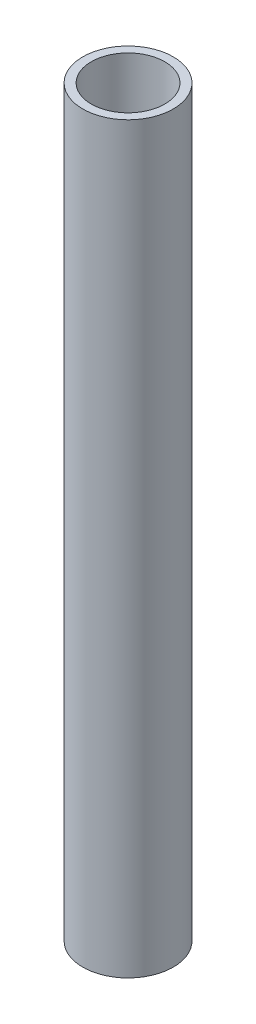
ISO-10303-21;
HEADER;
FILE_DESCRIPTION(('STEP AP214'),'2;1');
FILE_NAME('part.step','',(''),(''),'','','');
FILE_SCHEMA(('AUTOMOTIVE_DESIGN { 1 0 10303 214 1 1 1 1 }'));
ENDSEC;
DATA;
#1=APPLICATION_CONTEXT('core data for automotive mechanical design processes');
#2=APPLICATION_PROTOCOL_DEFINITION('international standard','automotive_design',2000,#1);
#3=PRODUCT_CONTEXT('',#1,'mechanical');
#4=PRODUCT('Part','Part','',(#3));
#5=PRODUCT_RELATED_PRODUCT_CATEGORY('part','',(#4));
#6=PRODUCT_DEFINITION_FORMATION('','',#4);
#7=PRODUCT_DEFINITION_CONTEXT('part definition',#1,'design');
#8=PRODUCT_DEFINITION('design','',#6,#7);
#9=PRODUCT_DEFINITION_SHAPE('','',#8);
#10=(LENGTH_UNIT() NAMED_UNIT(*) SI_UNIT(.MILLI.,.METRE.));
#11=(NAMED_UNIT(*) PLANE_ANGLE_UNIT() SI_UNIT($,.RADIAN.));
#12=(NAMED_UNIT(*) SI_UNIT($,.STERADIAN.) SOLID_ANGLE_UNIT());
#13=UNCERTAINTY_MEASURE_WITH_UNIT(LENGTH_MEASURE(1.E-05),#10,'distance_accuracy_value','');
#14=(GEOMETRIC_REPRESENTATION_CONTEXT(3) GLOBAL_UNCERTAINTY_ASSIGNED_CONTEXT((#13)) GLOBAL_UNIT_ASSIGNED_CONTEXT((#10,
#11,#12)) REPRESENTATION_CONTEXT('',''));
#15=CARTESIAN_POINT('',(0.,0.,0.));
#16=DIRECTION('',(0.,0.,1.));
#17=DIRECTION('',(1.,0.,0.));
#18=AXIS2_PLACEMENT_3D('',#15,#16,#17);
#19=CARTESIAN_POINT('',(2.48689957516035E-11,174.999999999999,1.50000000000061));
#20=DIRECTION('',(0.,0.999999999999999,0.));
#21=DIRECTION('',(0.,0.,1.));
#22=AXIS2_PLACEMENT_3D('',#19,#20,#21);
#23=PLANE('',#22);
#24=CARTESIAN_POINT('',(2.48689957516035E-11,174.999999999999,1.50000000000061));
#25=DIRECTION('',(0.,0.999999999999999,0.));
#26=DIRECTION('',(0.,0.,1.));
#27=AXIS2_PLACEMENT_3D('',#24,#25,#26);
#28=CIRCLE('',#27,10.65);
#29=CARTESIAN_POINT('',(2.47948378842671E-11,174.999999999999,-9.14999999999938));
#30=VERTEX_POINT('',#29);
#31=EDGE_CURVE('E12',#30,#30,#28,.T.);
#32=ORIENTED_EDGE('',*,*,#31,.T.);
#33=EDGE_LOOP('',(#32));
#34=FACE_BOUND('',#33,.T.);
#35=CARTESIAN_POINT('',(2.48689957516035E-11,174.999999999999,1.50000000000061));
#36=DIRECTION('',(0.,0.999999999999999,0.));
#37=DIRECTION('',(0.,0.,1.));
#38=AXIS2_PLACEMENT_3D('',#35,#36,#37);
#39=CIRCLE('',#38,8.65);
#40=CARTESIAN_POINT('',(2.48087642443303E-11,174.999999999999,-7.14999999999939));
#41=VERTEX_POINT('',#40);
#42=EDGE_CURVE('E60',#41,#41,#39,.T.);
#43=ORIENTED_EDGE('',*,*,#42,.F.);
#44=EDGE_LOOP('',(#43));
#45=FACE_BOUND('',#44,.T.);
#46=ADVANCED_FACE('F46',(#34,#45),#23,.T.);
#47=CARTESIAN_POINT('',(2.44249065417534E-11,-4.44089209850063E-13,1.50000000000061));
#48=DIRECTION('',(0.,0.999999999999999,0.));
#49=DIRECTION('',(0.,0.,1.));
#50=AXIS2_PLACEMENT_3D('',#47,#48,#49);
#51=PLANE('',#50);
#52=CARTESIAN_POINT('',(2.44249065417534E-11,-4.44089209850063E-13,1.50000000000061));
#53=DIRECTION('',(0.,0.999999999999999,0.));
#54=DIRECTION('',(0.,0.,1.));
#55=AXIS2_PLACEMENT_3D('',#52,#53,#54);
#56=CIRCLE('',#55,10.65);
#57=CARTESIAN_POINT('',(2.46438930430036E-11,-4.71844785465692E-13,-9.14999999999933));
#58=VERTEX_POINT('',#57);
#59=EDGE_CURVE('E50',#58,#58,#56,.T.);
#60=ORIENTED_EDGE('',*,*,#59,.F.);
#61=EDGE_LOOP('',(#60));
#62=FACE_BOUND('',#61,.T.);
#63=CARTESIAN_POINT('',(2.44249065417534E-11,-4.44089209850063E-13,1.50000000000061));
#64=DIRECTION('',(0.,0.999999999999999,0.));
#65=DIRECTION('',(0.,0.,1.));
#66=AXIS2_PLACEMENT_3D('',#63,#64,#65);
#67=CIRCLE('',#66,8.65);
#68=CARTESIAN_POINT('',(2.46578194030668E-11,-4.71844785465692E-13,-7.14999999999934));
#69=VERTEX_POINT('',#68);
#70=EDGE_CURVE('E62',#69,#69,#67,.T.);
#71=ORIENTED_EDGE('',*,*,#70,.T.);
#72=EDGE_LOOP('',(#71));
#73=FACE_BOUND('',#72,.T.);
#74=ADVANCED_FACE('F75',(#62,#73),#51,.F.);
#75=CARTESIAN_POINT('',(2.48689957516035E-11,174.999999999999,1.50000000000061));
#76=DIRECTION('',(0.,-0.999999999999999,0.));
#77=DIRECTION('',(0.,0.,-1.));
#78=AXIS2_PLACEMENT_3D('',#75,#76,#77);
#79=CYLINDRICAL_SURFACE('',#78,10.65);
#80=CARTESIAN_POINT('',(2.47948378842671E-11,174.999999999999,-9.14999999999938));
#81=CARTESIAN_POINT('',(2.47932655421706E-11,173.177083333333,-9.14999999999938));
#82=CARTESIAN_POINT('',(2.47916932000741E-11,171.354166666666,-9.14999999999938));
#83=CARTESIAN_POINT('',(2.47885485158811E-11,167.708333333333,-9.14999999999938));
#84=CARTESIAN_POINT('',(2.47869761737846E-11,165.885416666666,-9.14999999999938));
#85=CARTESIAN_POINT('',(2.47838314895916E-11,162.239583333333,-9.14999999999938));
#86=CARTESIAN_POINT('',(2.47822591474951E-11,160.416666666666,-9.14999999999938));
#87=CARTESIAN_POINT('',(2.47791144633021E-11,156.770833333333,-9.14999999999938));
#88=CARTESIAN_POINT('',(2.47775421212056E-11,154.947916666666,-9.14999999999938));
#89=CARTESIAN_POINT('',(2.47743974370127E-11,151.302083333333,-9.14999999999938));
#90=CARTESIAN_POINT('',(2.47728250949162E-11,149.479166666666,-9.14999999999938));
#91=CARTESIAN_POINT('',(2.47696804107232E-11,145.833333333333,-9.14999999999938));
#92=CARTESIAN_POINT('',(2.47681080686267E-11,144.010416666666,-9.14999999999937));
#93=CARTESIAN_POINT('',(2.47649633844337E-11,140.364583333333,-9.14999999999937));
#94=CARTESIAN_POINT('',(2.47633910423372E-11,138.541666666666,-9.14999999999937));
#95=CARTESIAN_POINT('',(2.47602463581442E-11,134.895833333333,-9.14999999999937));
#96=CARTESIAN_POINT('',(2.47586740160477E-11,133.072916666666,-9.14999999999937));
#97=CARTESIAN_POINT('',(2.47555293318547E-11,129.427083333333,-9.14999999999937));
#98=CARTESIAN_POINT('',(2.47539569897582E-11,127.604166666666,-9.14999999999937));
#99=CARTESIAN_POINT('',(2.47508123055652E-11,123.958333333333,-9.14999999999937));
#100=CARTESIAN_POINT('',(2.47492399634687E-11,122.135416666666,-9.14999999999937));
#101=CARTESIAN_POINT('',(2.47460952792758E-11,118.489583333333,-9.14999999999937));
#102=CARTESIAN_POINT('',(2.47445229371793E-11,116.666666666666,-9.14999999999936));
#103=CARTESIAN_POINT('',(2.47413782529863E-11,113.020833333333,-9.14999999999936));
#104=CARTESIAN_POINT('',(2.47398059108898E-11,111.197916666666,-9.14999999999936));
#105=CARTESIAN_POINT('',(2.47366612266968E-11,107.552083333333,-9.14999999999936));
#106=CARTESIAN_POINT('',(2.47350888846003E-11,105.729166666666,-9.14999999999936));
#107=CARTESIAN_POINT('',(2.47319442004073E-11,102.083333333333,-9.14999999999936));
#108=CARTESIAN_POINT('',(2.47303718583108E-11,100.260416666666,-9.14999999999936));
#109=CARTESIAN_POINT('',(2.47272271741178E-11,96.6145833333328,-9.14999999999936));
#110=CARTESIAN_POINT('',(2.47256548320213E-11,94.7916666666661,-9.14999999999936));
#111=CARTESIAN_POINT('',(2.47225101478283E-11,91.1458333333328,-9.14999999999936));
#112=CARTESIAN_POINT('',(2.47209378057318E-11,89.3229166666661,-9.14999999999936));
#113=CARTESIAN_POINT('',(2.47177931215389E-11,85.6770833333328,-9.14999999999936));
#114=CARTESIAN_POINT('',(2.47162207794424E-11,83.8541666666661,-9.14999999999936));
#115=CARTESIAN_POINT('',(2.47130760952494E-11,80.2083333333328,-9.14999999999936));
#116=CARTESIAN_POINT('',(2.47115037531529E-11,78.3854166666661,-9.14999999999936));
#117=CARTESIAN_POINT('',(2.47083590689599E-11,74.7395833333328,-9.14999999999936));
#118=CARTESIAN_POINT('',(2.47067867268634E-11,72.9166666666661,-9.14999999999935));
#119=CARTESIAN_POINT('',(2.47036420426704E-11,69.2708333333328,-9.14999999999935));
#120=CARTESIAN_POINT('',(2.47020697005739E-11,67.4479166666661,-9.14999999999935));
#121=CARTESIAN_POINT('',(2.46989250163809E-11,63.8020833333328,-9.14999999999935));
#122=CARTESIAN_POINT('',(2.46973526742844E-11,61.9791666666661,-9.14999999999935));
#123=CARTESIAN_POINT('',(2.46942079900914E-11,58.3333333333328,-9.14999999999935));
#124=CARTESIAN_POINT('',(2.46926356479949E-11,56.5104166666661,-9.14999999999935));
#125=CARTESIAN_POINT('',(2.4689490963802E-11,52.8645833333328,-9.14999999999935));
#126=CARTESIAN_POINT('',(2.46879186217055E-11,51.0416666666662,-9.14999999999935));
#127=CARTESIAN_POINT('',(2.46847739375125E-11,47.3958333333328,-9.14999999999935));
#128=CARTESIAN_POINT('',(2.4683201595416E-11,45.5729166666662,-9.14999999999935));
#129=CARTESIAN_POINT('',(2.4680056911223E-11,41.9270833333328,-9.14999999999935));
#130=CARTESIAN_POINT('',(2.46784845691265E-11,40.1041666666662,-9.14999999999934));
#131=CARTESIAN_POINT('',(2.46753398849335E-11,36.4583333333329,-9.14999999999934));
#132=CARTESIAN_POINT('',(2.4673767542837E-11,34.6354166666662,-9.14999999999934));
#133=CARTESIAN_POINT('',(2.4670622858644E-11,30.9895833333329,-9.14999999999934));
#134=CARTESIAN_POINT('',(2.46690505165475E-11,29.1666666666662,-9.14999999999934));
#135=CARTESIAN_POINT('',(2.46659058323545E-11,25.5208333333329,-9.14999999999934));
#136=CARTESIAN_POINT('',(2.4664333490258E-11,23.6979166666662,-9.14999999999934));
#137=CARTESIAN_POINT('',(2.46611888060651E-11,20.0520833333328,-9.14999999999934));
#138=CARTESIAN_POINT('',(2.46596164639686E-11,18.2291666666662,-9.14999999999934));
#139=CARTESIAN_POINT('',(2.46564717797756E-11,14.5833333333328,-9.14999999999934));
#140=CARTESIAN_POINT('',(2.46548994376791E-11,12.7604166666662,-9.14999999999934));
#141=CARTESIAN_POINT('',(2.46517547534861E-11,9.11458333333285,-9.14999999999934));
#142=CARTESIAN_POINT('',(2.46501824113896E-11,7.29166666666619,-9.14999999999934));
#143=CARTESIAN_POINT('',(2.46470377271966E-11,3.64583333333286,-9.14999999999934));
#144=CARTESIAN_POINT('',(2.46454653851001E-11,1.82291666666619,-9.14999999999933));
#145=CARTESIAN_POINT('',(2.46438930430036E-11,-4.71844785465692E-13,-9.14999999999933));
#146=B_SPLINE_CURVE_WITH_KNOTS('',3,(#80,#81,#82,#83,#84,#85,#86,#87,#88,#89,#90,#91,#92,#93,
#94,#95,#96,#97,#98,#99,#100,#101,#102,#103,#104,#105,#106,#107,#108,#109,#110,#111,#112,#113,
#114,#115,#116,#117,#118,#119,#120,#121,#122,#123,#124,#125,#126,#127,#128,#129,#130,#131,#132,
#133,#134,#135,#136,#137,#138,#139,#140,#141,#142,#143,#144,#145),.UNSPECIFIED.,.F.,.F.,(4,2,2,
2,2,2,2,2,2,2,2,2,2,2,2,2,2,2,2,2,2,2,2,2,2,2,2,2,2,2,2,2,4),(0.,5.46875000000002,10.9375,
16.40625,21.875,27.34375,32.8125,38.28125,43.75,49.21875,54.6875,60.15625,65.6249999999999,
71.0937499999999,76.5624999999999,82.0312499999999,87.4999999999999,92.9687499999999,
98.4374999999999,103.90625,109.375,114.84375,120.3125,125.78125,131.25,136.71875,142.1875,
147.65625,153.125,158.59375,164.0625,169.53125,175.),.UNSPECIFIED.);
#147=EDGE_CURVE('BSEAM48',#30,#58,#146,.T.);
#148=ORIENTED_EDGE('',*,*,#31,.F.);
#149=ORIENTED_EDGE('',*,*,#59,.T.);
#150=ORIENTED_EDGE('',*,*,#147,.T.);
#151=ORIENTED_EDGE('',*,*,#147,.F.);
#152=EDGE_LOOP('',(#148,#150,#149,#151));
#153=FACE_BOUND('',#152,.T.);
#154=ADVANCED_FACE('F48',(#153),#79,.T.);
#155=CARTESIAN_POINT('',(2.48689957516035E-11,174.999999999999,1.50000000000061));
#156=DIRECTION('',(0.,-0.999999999999999,0.));
#157=DIRECTION('',(0.,0.,-1.));
#158=AXIS2_PLACEMENT_3D('',#155,#156,#157);
#159=CYLINDRICAL_SURFACE('',#158,8.65);
#160=CARTESIAN_POINT('',(2.48087642443303E-11,174.999999999999,-7.14999999999939));
#161=CARTESIAN_POINT('',(2.48071919022338E-11,173.177083333333,-7.14999999999938));
#162=CARTESIAN_POINT('',(2.48056195601373E-11,171.354166666666,-7.14999999999938));
#163=CARTESIAN_POINT('',(2.48024748759443E-11,167.708333333333,-7.14999999999938));
#164=CARTESIAN_POINT('',(2.48009025338478E-11,165.885416666666,-7.14999999999938));
#165=CARTESIAN_POINT('',(2.47977578496548E-11,162.239583333333,-7.14999999999938));
#166=CARTESIAN_POINT('',(2.47961855075583E-11,160.416666666666,-7.14999999999938));
#167=CARTESIAN_POINT('',(2.47930408233653E-11,156.770833333333,-7.14999999999938));
#168=CARTESIAN_POINT('',(2.47914684812688E-11,154.947916666666,-7.14999999999938));
#169=CARTESIAN_POINT('',(2.47883237970758E-11,151.302083333333,-7.14999999999938));
#170=CARTESIAN_POINT('',(2.47867514549793E-11,149.479166666666,-7.14999999999938));
#171=CARTESIAN_POINT('',(2.47836067707864E-11,145.833333333333,-7.14999999999938));
#172=CARTESIAN_POINT('',(2.47820344286899E-11,144.010416666666,-7.14999999999938));
#173=CARTESIAN_POINT('',(2.47788897444969E-11,140.364583333333,-7.14999999999938));
#174=CARTESIAN_POINT('',(2.47773174024004E-11,138.541666666666,-7.14999999999938));
#175=CARTESIAN_POINT('',(2.47741727182074E-11,134.895833333333,-7.14999999999938));
#176=CARTESIAN_POINT('',(2.47726003761109E-11,133.072916666666,-7.14999999999938));
#177=CARTESIAN_POINT('',(2.47694556919179E-11,129.427083333333,-7.14999999999937));
#178=CARTESIAN_POINT('',(2.47678833498214E-11,127.604166666666,-7.14999999999937));
#179=CARTESIAN_POINT('',(2.47647386656284E-11,123.958333333333,-7.14999999999937));
#180=CARTESIAN_POINT('',(2.47631663235319E-11,122.135416666666,-7.14999999999937));
#181=CARTESIAN_POINT('',(2.47600216393389E-11,118.489583333333,-7.14999999999937));
#182=CARTESIAN_POINT('',(2.47584492972424E-11,116.666666666666,-7.14999999999937));
#183=CARTESIAN_POINT('',(2.47553046130495E-11,113.020833333333,-7.14999999999937));
#184=CARTESIAN_POINT('',(2.4753732270953E-11,111.197916666666,-7.14999999999937));
#185=CARTESIAN_POINT('',(2.475058758676E-11,107.552083333333,-7.14999999999937));
#186=CARTESIAN_POINT('',(2.47490152446635E-11,105.729166666666,-7.14999999999937));
#187=CARTESIAN_POINT('',(2.47458705604705E-11,102.083333333333,-7.14999999999937));
#188=CARTESIAN_POINT('',(2.4744298218374E-11,100.260416666666,-7.14999999999937));
#189=CARTESIAN_POINT('',(2.4741153534181E-11,96.6145833333328,-7.14999999999937));
#190=CARTESIAN_POINT('',(2.47395811920845E-11,94.7916666666661,-7.14999999999936));
#191=CARTESIAN_POINT('',(2.47364365078915E-11,91.1458333333328,-7.14999999999936));
#192=CARTESIAN_POINT('',(2.4734864165795E-11,89.3229166666661,-7.14999999999936));
#193=CARTESIAN_POINT('',(2.4731719481602E-11,85.6770833333328,-7.14999999999936));
#194=CARTESIAN_POINT('',(2.47301471395055E-11,83.8541666666661,-7.14999999999936));
#195=CARTESIAN_POINT('',(2.47270024553125E-11,80.2083333333328,-7.14999999999936));
#196=CARTESIAN_POINT('',(2.47254301132161E-11,78.3854166666661,-7.14999999999936));
#197=CARTESIAN_POINT('',(2.47222854290231E-11,74.7395833333328,-7.14999999999936));
#198=CARTESIAN_POINT('',(2.47207130869266E-11,72.9166666666661,-7.14999999999936));
#199=CARTESIAN_POINT('',(2.47175684027336E-11,69.2708333333328,-7.14999999999936));
#200=CARTESIAN_POINT('',(2.47159960606371E-11,67.4479166666661,-7.14999999999936));
#201=CARTESIAN_POINT('',(2.47128513764441E-11,63.8020833333328,-7.14999999999935));
#202=CARTESIAN_POINT('',(2.47112790343476E-11,61.9791666666661,-7.14999999999935));
#203=CARTESIAN_POINT('',(2.47081343501546E-11,58.3333333333328,-7.14999999999935));
#204=CARTESIAN_POINT('',(2.47065620080581E-11,56.5104166666661,-7.14999999999935));
#205=CARTESIAN_POINT('',(2.47034173238651E-11,52.8645833333328,-7.14999999999935));
#206=CARTESIAN_POINT('',(2.47018449817686E-11,51.0416666666662,-7.14999999999935));
#207=CARTESIAN_POINT('',(2.46987002975756E-11,47.3958333333328,-7.14999999999935));
#208=CARTESIAN_POINT('',(2.46971279554791E-11,45.5729166666662,-7.14999999999935));
#209=CARTESIAN_POINT('',(2.46939832712862E-11,41.9270833333328,-7.14999999999935));
#210=CARTESIAN_POINT('',(2.46924109291897E-11,40.1041666666662,-7.14999999999935));
#211=CARTESIAN_POINT('',(2.46892662449967E-11,36.4583333333329,-7.14999999999935));
#212=CARTESIAN_POINT('',(2.46876939029002E-11,34.6354166666662,-7.14999999999935));
#213=CARTESIAN_POINT('',(2.46845492187072E-11,30.9895833333329,-7.14999999999935));
#214=CARTESIAN_POINT('',(2.46829768766107E-11,29.1666666666662,-7.14999999999935));
#215=CARTESIAN_POINT('',(2.46798321924177E-11,25.5208333333329,-7.14999999999934));
#216=CARTESIAN_POINT('',(2.46782598503212E-11,23.6979166666662,-7.14999999999934));
#217=CARTESIAN_POINT('',(2.46751151661282E-11,20.0520833333328,-7.14999999999934));
#218=CARTESIAN_POINT('',(2.46735428240317E-11,18.2291666666662,-7.14999999999934));
#219=CARTESIAN_POINT('',(2.46703981398387E-11,14.5833333333328,-7.14999999999934));
#220=CARTESIAN_POINT('',(2.46688257977423E-11,12.7604166666662,-7.14999999999934));
#221=CARTESIAN_POINT('',(2.46656811135493E-11,9.11458333333285,-7.14999999999934));
#222=CARTESIAN_POINT('',(2.46641087714528E-11,7.29166666666619,-7.14999999999934));
#223=CARTESIAN_POINT('',(2.46609640872598E-11,3.64583333333286,-7.14999999999934));
#224=CARTESIAN_POINT('',(2.46593917451633E-11,1.82291666666619,-7.14999999999934));
#225=CARTESIAN_POINT('',(2.46578194030668E-11,-4.71844785465692E-13,-7.14999999999934));
#226=B_SPLINE_CURVE_WITH_KNOTS('',3,(#160,#161,#162,#163,#164,#165,#166,#167,#168,#169,#170,
#171,#172,#173,#174,#175,#176,#177,#178,#179,#180,#181,#182,#183,#184,#185,#186,#187,#188,#189,
#190,#191,#192,#193,#194,#195,#196,#197,#198,#199,#200,#201,#202,#203,#204,#205,#206,#207,#208,
#209,#210,#211,#212,#213,#214,#215,#216,#217,#218,#219,#220,#221,#222,#223,#224,#225),
.UNSPECIFIED.,.F.,.F.,(4,2,2,2,2,2,2,2,2,2,2,2,2,2,2,2,2,2,2,2,2,2,2,2,2,2,2,2,2,2,2,2,4),(0.,
5.46875000000002,10.9375,16.40625,21.875,27.34375,32.8125,38.28125,43.75,49.21875,54.6875,
60.15625,65.6249999999999,71.0937499999999,76.5624999999999,82.0312499999999,87.4999999999999,
92.9687499999999,98.4374999999999,103.90625,109.375,114.84375,120.3125,125.78125,131.25,
136.71875,142.1875,147.65625,153.125,158.59375,164.0625,169.53125,175.),.UNSPECIFIED.);
#227=EDGE_CURVE('BSEAM71',#41,#69,#226,.T.);
#228=ORIENTED_EDGE('',*,*,#42,.T.);
#229=ORIENTED_EDGE('',*,*,#70,.F.);
#230=ORIENTED_EDGE('',*,*,#227,.T.);
#231=ORIENTED_EDGE('',*,*,#227,.F.);
#232=EDGE_LOOP('',(#228,#230,#229,#231));
#233=FACE_BOUND('',#232,.T.);
#234=ADVANCED_FACE('F71',(#233),#159,.F.);
#235=CLOSED_SHELL('',(#46,#74,#154,#234));
#236=MANIFOLD_SOLID_BREP('B2',#235);
#237=ADVANCED_BREP_SHAPE_REPRESENTATION('',(#18,#236),#14);
#238=SHAPE_DEFINITION_REPRESENTATION(#9,#237);
ENDSEC;
END-ISO-10303-21;
